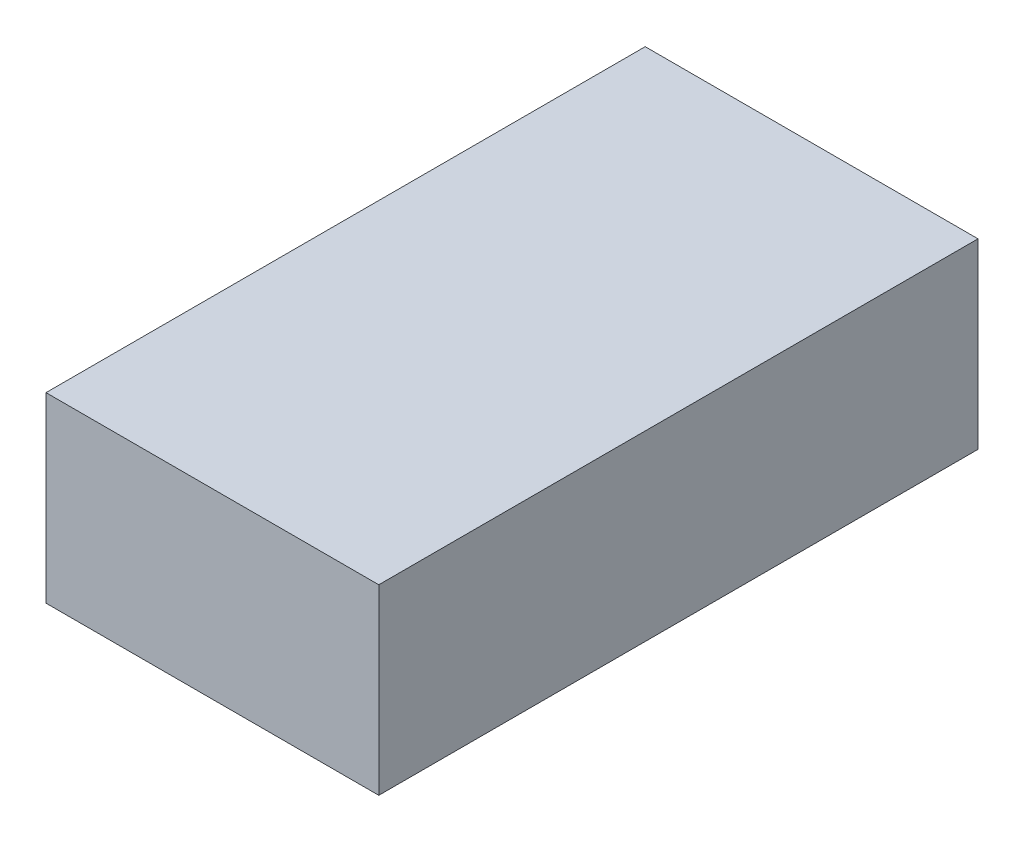
ISO-10303-21;
HEADER;
FILE_DESCRIPTION(('STEP AP214'),'2;1');
FILE_NAME('part.step','',(''),(''),'','','');
FILE_SCHEMA(('AUTOMOTIVE_DESIGN { 1 0 10303 214 1 1 1 1 }'));
ENDSEC;
DATA;
#1=APPLICATION_CONTEXT('core data for automotive mechanical design processes');
#2=APPLICATION_PROTOCOL_DEFINITION('international standard','automotive_design',2000,#1);
#3=PRODUCT_CONTEXT('',#1,'mechanical');
#4=PRODUCT('Part','Part','',(#3));
#5=PRODUCT_RELATED_PRODUCT_CATEGORY('part','',(#4));
#6=PRODUCT_DEFINITION_FORMATION('','',#4);
#7=PRODUCT_DEFINITION_CONTEXT('part definition',#1,'design');
#8=PRODUCT_DEFINITION('design','',#6,#7);
#9=PRODUCT_DEFINITION_SHAPE('','',#8);
#10=(LENGTH_UNIT() NAMED_UNIT(*) SI_UNIT(.MILLI.,.METRE.));
#11=(NAMED_UNIT(*) PLANE_ANGLE_UNIT() SI_UNIT($,.RADIAN.));
#12=(NAMED_UNIT(*) SI_UNIT($,.STERADIAN.) SOLID_ANGLE_UNIT());
#13=UNCERTAINTY_MEASURE_WITH_UNIT(LENGTH_MEASURE(1.E-05),#10,'distance_accuracy_value','');
#14=(GEOMETRIC_REPRESENTATION_CONTEXT(3) GLOBAL_UNCERTAINTY_ASSIGNED_CONTEXT((#13)) GLOBAL_UNIT_ASSIGNED_CONTEXT((#10,
#11,#12)) REPRESENTATION_CONTEXT('',''));
#15=CARTESIAN_POINT('',(0.,0.,0.));
#16=DIRECTION('',(0.,0.,1.));
#17=DIRECTION('',(1.,0.,0.));
#18=AXIS2_PLACEMENT_3D('',#15,#16,#17);
#19=CARTESIAN_POINT('',(-20.0525,15.5175,28.5565));
#20=DIRECTION('',(1.,0.,0.));
#21=DIRECTION('',(0.,0.,-1.));
#22=AXIS2_PLACEMENT_3D('',#19,#20,#21);
#23=PLANE('',#22);
#24=DIRECTION('',(0.,-1.,0.));
#25=VECTOR('',#24,1.);
#26=CARTESIAN_POINT('',(-20.0525,15.5175,-28.5565));
#27=LINE('',#26,#25);
#28=CARTESIAN_POINT('',(-20.0525,15.5175,-28.5565));
#29=VERTEX_POINT('',#28);
#30=CARTESIAN_POINT('',(-20.0525,-1.8635,-28.5565));
#31=VERTEX_POINT('',#30);
#32=EDGE_CURVE('E101',#29,#31,#27,.T.);
#33=ORIENTED_EDGE('',*,*,#32,.T.);
#34=DIRECTION('',(0.,0.,-1.));
#35=VECTOR('',#34,1.);
#36=CARTESIAN_POINT('',(-20.0525,-1.8635,28.5565));
#37=LINE('',#36,#35);
#38=CARTESIAN_POINT('',(-20.0525,-1.8635,28.5565));
#39=VERTEX_POINT('',#38);
#40=EDGE_CURVE('E11',#39,#31,#37,.T.);
#41=ORIENTED_EDGE('',*,*,#40,.F.);
#42=DIRECTION('',(0.,-1.,0.));
#43=VECTOR('',#42,1.);
#44=CARTESIAN_POINT('',(-20.0525,15.5175,28.5565));
#45=LINE('',#44,#43);
#46=CARTESIAN_POINT('',(-20.0525,15.5175,28.5565));
#47=VERTEX_POINT('',#46);
#48=EDGE_CURVE('E95',#47,#39,#45,.T.);
#49=ORIENTED_EDGE('',*,*,#48,.F.);
#50=DIRECTION('',(0.,0.,-1.));
#51=VECTOR('',#50,1.);
#52=CARTESIAN_POINT('',(-20.0525,15.5175,28.5565));
#53=LINE('',#52,#51);
#54=EDGE_CURVE('E99',#47,#29,#53,.T.);
#55=ORIENTED_EDGE('',*,*,#54,.T.);
#56=EDGE_LOOP('',(#33,#41,#49,#55));
#57=FACE_BOUND('',#56,.T.);
#58=ADVANCED_FACE('F41',(#57),#23,.F.);
#59=CARTESIAN_POINT('',(-20.0525,-1.8635,28.5565));
#60=DIRECTION('',(0.,1.,0.));
#61=DIRECTION('',(0.,0.,1.));
#62=AXIS2_PLACEMENT_3D('',#59,#60,#61);
#63=PLANE('',#62);
#64=DIRECTION('',(1.,0.,0.));
#65=VECTOR('',#64,1.);
#66=CARTESIAN_POINT('',(-20.0525,-1.8635,-28.5565));
#67=LINE('',#66,#65);
#68=CARTESIAN_POINT('',(11.6665,-1.8635,-28.5565));
#69=VERTEX_POINT('',#68);
#70=EDGE_CURVE('E96',#31,#69,#67,.T.);
#71=ORIENTED_EDGE('',*,*,#70,.T.);
#72=DIRECTION('',(0.,0.,-1.));
#73=VECTOR('',#72,1.);
#74=CARTESIAN_POINT('',(11.6665,-1.8635,28.5565));
#75=LINE('',#74,#73);
#76=CARTESIAN_POINT('',(11.6665,-1.8635,28.5565));
#77=VERTEX_POINT('',#76);
#78=EDGE_CURVE('E47',#77,#69,#75,.T.);
#79=ORIENTED_EDGE('',*,*,#78,.F.);
#80=DIRECTION('',(1.,0.,0.));
#81=VECTOR('',#80,1.);
#82=CARTESIAN_POINT('',(-20.0525,-1.8635,28.5565));
#83=LINE('',#82,#81);
#84=EDGE_CURVE('E90',#39,#77,#83,.T.);
#85=ORIENTED_EDGE('',*,*,#84,.F.);
#86=ORIENTED_EDGE('',*,*,#40,.T.);
#87=EDGE_LOOP('',(#71,#79,#85,#86));
#88=FACE_BOUND('',#87,.T.);
#89=ADVANCED_FACE('F94',(#88),#63,.F.);
#90=CARTESIAN_POINT('',(11.6665,-1.8635,28.5565));
#91=DIRECTION('',(-1.,0.,0.));
#92=DIRECTION('',(0.,0.,1.));
#93=AXIS2_PLACEMENT_3D('',#90,#91,#92);
#94=PLANE('',#93);
#95=DIRECTION('',(0.,1.,0.));
#96=VECTOR('',#95,1.);
#97=CARTESIAN_POINT('',(11.6665,-1.8635,-28.5565));
#98=LINE('',#97,#96);
#99=CARTESIAN_POINT('',(11.6665,15.5175,-28.5565));
#100=VERTEX_POINT('',#99);
#101=EDGE_CURVE('E71',#69,#100,#98,.T.);
#102=ORIENTED_EDGE('',*,*,#101,.T.);
#103=DIRECTION('',(0.,0.,-1.));
#104=VECTOR('',#103,1.);
#105=CARTESIAN_POINT('',(11.6665,15.5175,28.5565));
#106=LINE('',#105,#104);
#107=CARTESIAN_POINT('',(11.6665,15.5175,28.5565));
#108=VERTEX_POINT('',#107);
#109=EDGE_CURVE('E100',#108,#100,#106,.T.);
#110=ORIENTED_EDGE('',*,*,#109,.F.);
#111=DIRECTION('',(0.,1.,0.));
#112=VECTOR('',#111,1.);
#113=CARTESIAN_POINT('',(11.6665,-1.8635,28.5565));
#114=LINE('',#113,#112);
#115=EDGE_CURVE('E89',#77,#108,#114,.T.);
#116=ORIENTED_EDGE('',*,*,#115,.F.);
#117=ORIENTED_EDGE('',*,*,#78,.T.);
#118=EDGE_LOOP('',(#102,#110,#116,#117));
#119=FACE_BOUND('',#118,.T.);
#120=ADVANCED_FACE('F97',(#119),#94,.F.);
#121=CARTESIAN_POINT('',(11.6665,15.5175,28.5565));
#122=DIRECTION('',(0.,-1.,0.));
#123=DIRECTION('',(0.,0.,-1.));
#124=AXIS2_PLACEMENT_3D('',#121,#122,#123);
#125=PLANE('',#124);
#126=DIRECTION('',(-1.,0.,0.));
#127=VECTOR('',#126,1.);
#128=CARTESIAN_POINT('',(11.6665,15.5175,-28.5565));
#129=LINE('',#128,#127);
#130=EDGE_CURVE('E79',#100,#29,#129,.T.);
#131=ORIENTED_EDGE('',*,*,#130,.T.);
#132=ORIENTED_EDGE('',*,*,#54,.F.);
#133=DIRECTION('',(-1.,0.,0.));
#134=VECTOR('',#133,1.);
#135=CARTESIAN_POINT('',(11.6665,15.5175,28.5565));
#136=LINE('',#135,#134);
#137=EDGE_CURVE('E60',#108,#47,#136,.T.);
#138=ORIENTED_EDGE('',*,*,#137,.F.);
#139=ORIENTED_EDGE('',*,*,#109,.T.);
#140=EDGE_LOOP('',(#131,#132,#138,#139));
#141=FACE_BOUND('',#140,.T.);
#142=ADVANCED_FACE('F112',(#141),#125,.F.);
#143=CARTESIAN_POINT('',(0.,0.,28.5565));
#144=DIRECTION('',(0.,0.,1.));
#145=DIRECTION('',(1.,0.,0.));
#146=AXIS2_PLACEMENT_3D('',#143,#144,#145);
#147=PLANE('',#146);
#148=ORIENTED_EDGE('',*,*,#48,.T.);
#149=ORIENTED_EDGE('',*,*,#84,.T.);
#150=ORIENTED_EDGE('',*,*,#115,.T.);
#151=ORIENTED_EDGE('',*,*,#137,.T.);
#152=EDGE_LOOP('',(#148,#149,#150,#151));
#153=FACE_BOUND('',#152,.T.);
#154=ADVANCED_FACE('F88',(#153),#147,.T.);
#155=CARTESIAN_POINT('',(0.,0.,-28.5565));
#156=DIRECTION('',(0.,0.,1.));
#157=DIRECTION('',(1.,0.,0.));
#158=AXIS2_PLACEMENT_3D('',#155,#156,#157);
#159=PLANE('',#158);
#160=ORIENTED_EDGE('',*,*,#32,.F.);
#161=ORIENTED_EDGE('',*,*,#130,.F.);
#162=ORIENTED_EDGE('',*,*,#101,.F.);
#163=ORIENTED_EDGE('',*,*,#70,.F.);
#164=EDGE_LOOP('',(#160,#161,#162,#163));
#165=FACE_BOUND('',#164,.T.);
#166=ADVANCED_FACE('F114',(#165),#159,.F.);
#167=CLOSED_SHELL('',(#58,#89,#120,#142,#154,#166));
#168=MANIFOLD_SOLID_BREP('B2',#167);
#169=ADVANCED_BREP_SHAPE_REPRESENTATION('',(#18,#168),#14);
#170=SHAPE_DEFINITION_REPRESENTATION(#9,#169);
ENDSEC;
END-ISO-10303-21;
